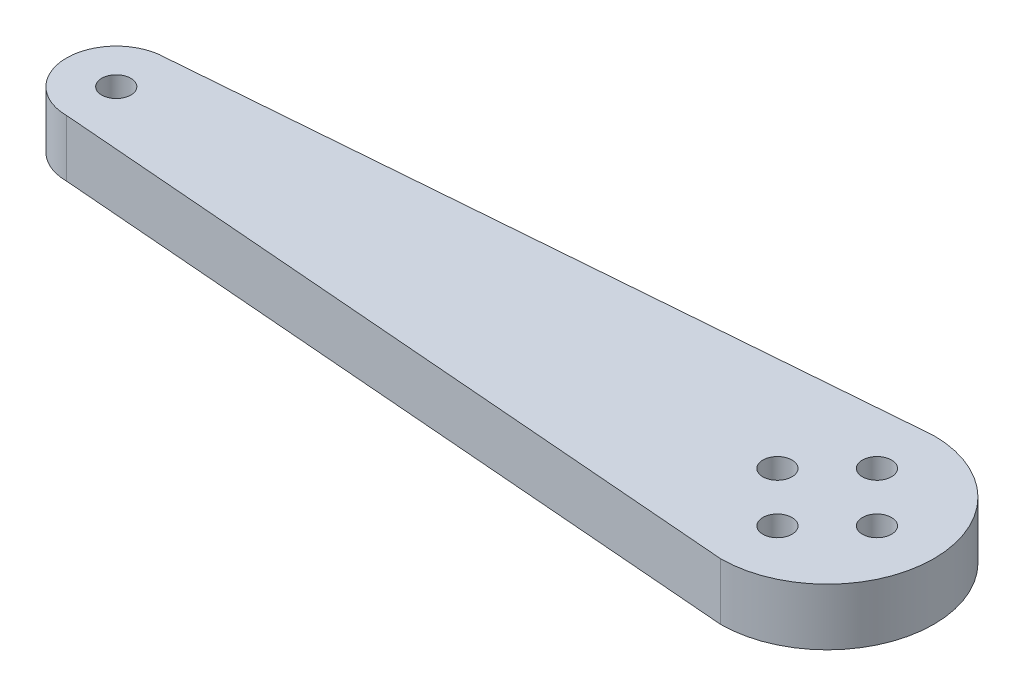
ISO-10303-21;
HEADER;
FILE_DESCRIPTION(('STEP AP214'),'2;1');
FILE_NAME('part.step','',(''),(''),'','','');
FILE_SCHEMA(('AUTOMOTIVE_DESIGN { 1 0 10303 214 1 1 1 1 }'));
ENDSEC;
DATA;
#1=APPLICATION_CONTEXT('core data for automotive mechanical design processes');
#2=APPLICATION_PROTOCOL_DEFINITION('international standard','automotive_design',2000,#1);
#3=PRODUCT_CONTEXT('',#1,'mechanical');
#4=PRODUCT('Part','Part','',(#3));
#5=PRODUCT_RELATED_PRODUCT_CATEGORY('part','',(#4));
#6=PRODUCT_DEFINITION_FORMATION('','',#4);
#7=PRODUCT_DEFINITION_CONTEXT('part definition',#1,'design');
#8=PRODUCT_DEFINITION('design','',#6,#7);
#9=PRODUCT_DEFINITION_SHAPE('','',#8);
#10=(LENGTH_UNIT() NAMED_UNIT(*) SI_UNIT(.MILLI.,.METRE.));
#11=(NAMED_UNIT(*) PLANE_ANGLE_UNIT() SI_UNIT($,.RADIAN.));
#12=(NAMED_UNIT(*) SI_UNIT($,.STERADIAN.) SOLID_ANGLE_UNIT());
#13=UNCERTAINTY_MEASURE_WITH_UNIT(LENGTH_MEASURE(1.E-05),#10,'distance_accuracy_value','');
#14=(GEOMETRIC_REPRESENTATION_CONTEXT(3) GLOBAL_UNCERTAINTY_ASSIGNED_CONTEXT((#13)) GLOBAL_UNIT_ASSIGNED_CONTEXT((#10,
#11,#12)) REPRESENTATION_CONTEXT('',''));
#15=CARTESIAN_POINT('',(0.,0.,0.));
#16=DIRECTION('',(0.,0.,1.));
#17=DIRECTION('',(1.,0.,0.));
#18=AXIS2_PLACEMENT_3D('',#15,#16,#17);
#19=CARTESIAN_POINT('',(100.,8.,0.));
#20=DIRECTION('',(0.,1.,0.));
#21=DIRECTION('',(0.,0.,1.));
#22=AXIS2_PLACEMENT_3D('',#19,#20,#21);
#23=PLANE('',#22);
#24=CARTESIAN_POINT('',(107.,8.,0.));
#25=DIRECTION('',(0.,1.,0.));
#26=DIRECTION('',(0.,0.,1.));
#27=AXIS2_PLACEMENT_3D('',#24,#25,#26);
#28=CIRCLE('',#27,2.04999999999999);
#29=CARTESIAN_POINT('',(107.,8.,2.04999999999999));
#30=VERTEX_POINT('',#29);
#31=EDGE_CURVE('E154',#30,#30,#28,.T.);
#32=ORIENTED_EDGE('',*,*,#31,.F.);
#33=EDGE_LOOP('',(#32));
#34=FACE_BOUND('',#33,.T.);
#35=CARTESIAN_POINT('',(100.,8.,7.));
#36=DIRECTION('',(0.,1.,0.));
#37=DIRECTION('',(0.,0.,1.));
#38=AXIS2_PLACEMENT_3D('',#35,#36,#37);
#39=CIRCLE('',#38,2.04999999999999);
#40=CARTESIAN_POINT('',(100.,8.,9.04999999999999));
#41=VERTEX_POINT('',#40);
#42=EDGE_CURVE('E138',#41,#41,#39,.T.);
#43=ORIENTED_EDGE('',*,*,#42,.F.);
#44=EDGE_LOOP('',(#43));
#45=FACE_BOUND('',#44,.T.);
#46=CARTESIAN_POINT('',(100.,8.,0.));
#47=DIRECTION('',(0.,1.,0.));
#48=DIRECTION('',(0.,0.,1.));
#49=AXIS2_PLACEMENT_3D('',#46,#47,#48);
#50=CIRCLE('',#49,15.);
#51=CARTESIAN_POINT('',(100.,8.,15.));
#52=VERTEX_POINT('',#51);
#53=CARTESIAN_POINT('',(100.,8.,-15.));
#54=VERTEX_POINT('',#53);
#55=EDGE_CURVE('E96',#52,#54,#50,.T.);
#56=ORIENTED_EDGE('',*,*,#55,.T.);
#57=DIRECTION('',(-0.996815278536125,0.,0.07974522228289));
#58=VECTOR('',#57,1.);
#59=CARTESIAN_POINT('',(100.,8.,-15.));
#60=LINE('',#59,#58);
#61=CARTESIAN_POINT('',(0.,8.,-7.));
#62=VERTEX_POINT('',#61);
#63=EDGE_CURVE('E91',#54,#62,#60,.T.);
#64=ORIENTED_EDGE('',*,*,#63,.T.);
#65=CARTESIAN_POINT('',(0.,8.,0.));
#66=DIRECTION('',(0.,1.,0.));
#67=DIRECTION('',(0.,0.,1.));
#68=AXIS2_PLACEMENT_3D('',#65,#66,#67);
#69=CIRCLE('',#68,7.);
#70=CARTESIAN_POINT('',(0.,8.,7.));
#71=VERTEX_POINT('',#70);
#72=EDGE_CURVE('E94',#62,#71,#69,.T.);
#73=ORIENTED_EDGE('',*,*,#72,.T.);
#74=DIRECTION('',(0.996815278536125,0.,0.07974522228289));
#75=VECTOR('',#74,1.);
#76=CARTESIAN_POINT('',(100.,8.,15.));
#77=LINE('',#76,#75);
#78=EDGE_CURVE('E61',#71,#52,#77,.T.);
#79=ORIENTED_EDGE('',*,*,#78,.T.);
#80=EDGE_LOOP('',(#56,#64,#73,#79));
#81=FACE_BOUND('',#80,.T.);
#82=CARTESIAN_POINT('',(100.,8.,-7.));
#83=DIRECTION('',(0.,1.,0.));
#84=DIRECTION('',(0.,0.,1.));
#85=AXIS2_PLACEMENT_3D('',#82,#83,#84);
#86=CIRCLE('',#85,2.04999999999999);
#87=CARTESIAN_POINT('',(100.,8.,-4.95000000000001));
#88=VERTEX_POINT('',#87);
#89=EDGE_CURVE('E116',#88,#88,#86,.T.);
#90=ORIENTED_EDGE('',*,*,#89,.F.);
#91=EDGE_LOOP('',(#90));
#92=FACE_BOUND('',#91,.T.);
#93=CARTESIAN_POINT('',(93.,8.,0.));
#94=DIRECTION('',(0.,1.,0.));
#95=DIRECTION('',(0.,0.,1.));
#96=AXIS2_PLACEMENT_3D('',#93,#94,#95);
#97=CIRCLE('',#96,2.04999999999999);
#98=CARTESIAN_POINT('',(93.,8.,2.04999999999999));
#99=VERTEX_POINT('',#98);
#100=EDGE_CURVE('E146',#99,#99,#97,.T.);
#101=ORIENTED_EDGE('',*,*,#100,.F.);
#102=EDGE_LOOP('',(#101));
#103=FACE_BOUND('',#102,.T.);
#104=CARTESIAN_POINT('',(0.,8.,0.));
#105=DIRECTION('',(0.,1.,0.));
#106=DIRECTION('',(0.,0.,1.));
#107=AXIS2_PLACEMENT_3D('',#104,#105,#106);
#108=CIRCLE('',#107,2.05);
#109=CARTESIAN_POINT('',(0.,8.,2.05));
#110=VERTEX_POINT('',#109);
#111=EDGE_CURVE('E162',#110,#110,#108,.T.);
#112=ORIENTED_EDGE('',*,*,#111,.F.);
#113=EDGE_LOOP('',(#112));
#114=FACE_BOUND('',#113,.T.);
#115=ADVANCED_FACE('F43',(#34,#45,#81,#92,#103,#114),#23,.T.);
#116=CARTESIAN_POINT('',(100.,0.,0.));
#117=DIRECTION('',(0.,1.,0.));
#118=DIRECTION('',(0.,0.,1.));
#119=AXIS2_PLACEMENT_3D('',#116,#117,#118);
#120=PLANE('',#119);
#121=CARTESIAN_POINT('',(100.,0.,0.));
#122=DIRECTION('',(0.,1.,0.));
#123=DIRECTION('',(0.,0.,1.));
#124=AXIS2_PLACEMENT_3D('',#121,#122,#123);
#125=CIRCLE('',#124,15.);
#126=CARTESIAN_POINT('',(100.,0.,15.));
#127=VERTEX_POINT('',#126);
#128=CARTESIAN_POINT('',(100.,0.,-15.));
#129=VERTEX_POINT('',#128);
#130=EDGE_CURVE('E112',#127,#129,#125,.T.);
#131=ORIENTED_EDGE('',*,*,#130,.F.);
#132=DIRECTION('',(0.996815278536125,0.,0.07974522228289));
#133=VECTOR('',#132,1.);
#134=CARTESIAN_POINT('',(100.,0.,15.));
#135=LINE('',#134,#133);
#136=CARTESIAN_POINT('',(0.,0.,7.));
#137=VERTEX_POINT('',#136);
#138=EDGE_CURVE('E84',#137,#127,#135,.T.);
#139=ORIENTED_EDGE('',*,*,#138,.F.);
#140=CARTESIAN_POINT('',(0.,0.,0.));
#141=DIRECTION('',(0.,1.,0.));
#142=DIRECTION('',(0.,0.,1.));
#143=AXIS2_PLACEMENT_3D('',#140,#141,#142);
#144=CIRCLE('',#143,7.);
#145=CARTESIAN_POINT('',(0.,0.,-7.));
#146=VERTEX_POINT('',#145);
#147=EDGE_CURVE('E78',#146,#137,#144,.T.);
#148=ORIENTED_EDGE('',*,*,#147,.F.);
#149=DIRECTION('',(-0.996815278536125,0.,0.07974522228289));
#150=VECTOR('',#149,1.);
#151=CARTESIAN_POINT('',(100.,0.,-15.));
#152=LINE('',#151,#150);
#153=EDGE_CURVE('E101',#129,#146,#152,.T.);
#154=ORIENTED_EDGE('',*,*,#153,.F.);
#155=EDGE_LOOP('',(#131,#139,#148,#154));
#156=FACE_BOUND('',#155,.T.);
#157=CARTESIAN_POINT('',(100.,0.,-7.));
#158=DIRECTION('',(0.,1.,0.));
#159=DIRECTION('',(0.,0.,1.));
#160=AXIS2_PLACEMENT_3D('',#157,#158,#159);
#161=CIRCLE('',#160,2.04999999999999);
#162=CARTESIAN_POINT('',(100.,0.,-4.95000000000001));
#163=VERTEX_POINT('',#162);
#164=EDGE_CURVE('E134',#163,#163,#161,.T.);
#165=ORIENTED_EDGE('',*,*,#164,.T.);
#166=EDGE_LOOP('',(#165));
#167=FACE_BOUND('',#166,.T.);
#168=CARTESIAN_POINT('',(100.,0.,7.));
#169=DIRECTION('',(0.,1.,0.));
#170=DIRECTION('',(0.,0.,1.));
#171=AXIS2_PLACEMENT_3D('',#168,#169,#170);
#172=CIRCLE('',#171,2.04999999999999);
#173=CARTESIAN_POINT('',(100.,0.,9.04999999999999));
#174=VERTEX_POINT('',#173);
#175=EDGE_CURVE('E142',#174,#174,#172,.T.);
#176=ORIENTED_EDGE('',*,*,#175,.T.);
#177=EDGE_LOOP('',(#176));
#178=FACE_BOUND('',#177,.T.);
#179=CARTESIAN_POINT('',(93.,0.,0.));
#180=DIRECTION('',(0.,1.,0.));
#181=DIRECTION('',(0.,0.,1.));
#182=AXIS2_PLACEMENT_3D('',#179,#180,#181);
#183=CIRCLE('',#182,2.04999999999999);
#184=CARTESIAN_POINT('',(93.,0.,2.04999999999999));
#185=VERTEX_POINT('',#184);
#186=EDGE_CURVE('E150',#185,#185,#183,.T.);
#187=ORIENTED_EDGE('',*,*,#186,.T.);
#188=EDGE_LOOP('',(#187));
#189=FACE_BOUND('',#188,.T.);
#190=CARTESIAN_POINT('',(107.,0.,0.));
#191=DIRECTION('',(0.,1.,0.));
#192=DIRECTION('',(0.,0.,1.));
#193=AXIS2_PLACEMENT_3D('',#190,#191,#192);
#194=CIRCLE('',#193,2.04999999999999);
#195=CARTESIAN_POINT('',(107.,0.,2.04999999999999));
#196=VERTEX_POINT('',#195);
#197=EDGE_CURVE('E158',#196,#196,#194,.T.);
#198=ORIENTED_EDGE('',*,*,#197,.T.);
#199=EDGE_LOOP('',(#198));
#200=FACE_BOUND('',#199,.T.);
#201=CARTESIAN_POINT('',(0.,0.,0.));
#202=DIRECTION('',(0.,1.,0.));
#203=DIRECTION('',(0.,0.,1.));
#204=AXIS2_PLACEMENT_3D('',#201,#202,#203);
#205=CIRCLE('',#204,2.05);
#206=CARTESIAN_POINT('',(0.,0.,2.05));
#207=VERTEX_POINT('',#206);
#208=EDGE_CURVE('E166',#207,#207,#205,.T.);
#209=ORIENTED_EDGE('',*,*,#208,.T.);
#210=EDGE_LOOP('',(#209));
#211=FACE_BOUND('',#210,.T.);
#212=ADVANCED_FACE('F129',(#156,#167,#178,#189,#200,#211),#120,.F.);
#213=CARTESIAN_POINT('',(100.,8.,0.));
#214=DIRECTION('',(0.,-1.,0.));
#215=DIRECTION('',(0.,0.,-1.));
#216=AXIS2_PLACEMENT_3D('',#213,#214,#215);
#217=CYLINDRICAL_SURFACE('',#216,15.);
#218=ORIENTED_EDGE('',*,*,#130,.T.);
#219=DIRECTION('',(0.,-1.,0.));
#220=VECTOR('',#219,1.);
#221=CARTESIAN_POINT('',(100.,8.,-15.));
#222=LINE('',#221,#220);
#223=EDGE_CURVE('E11',#54,#129,#222,.T.);
#224=ORIENTED_EDGE('',*,*,#223,.F.);
#225=ORIENTED_EDGE('',*,*,#55,.F.);
#226=DIRECTION('',(0.,-1.,0.));
#227=VECTOR('',#226,1.);
#228=CARTESIAN_POINT('',(100.,8.,15.));
#229=LINE('',#228,#227);
#230=EDGE_CURVE('E108',#52,#127,#229,.T.);
#231=ORIENTED_EDGE('',*,*,#230,.T.);
#232=EDGE_LOOP('',(#218,#224,#225,#231));
#233=FACE_BOUND('',#232,.T.);
#234=ADVANCED_FACE('F45',(#233),#217,.T.);
#235=CARTESIAN_POINT('',(100.,8.,-15.));
#236=DIRECTION('',(0.07974522228289,0.,0.996815278536125));
#237=DIRECTION('',(0.996815278536125,0.,-0.07974522228289));
#238=AXIS2_PLACEMENT_3D('',#235,#236,#237);
#239=PLANE('',#238);
#240=ORIENTED_EDGE('',*,*,#153,.T.);
#241=DIRECTION('',(0.,-1.,0.));
#242=VECTOR('',#241,1.);
#243=CARTESIAN_POINT('',(0.,8.,-7.));
#244=LINE('',#243,#242);
#245=EDGE_CURVE('E53',#62,#146,#244,.T.);
#246=ORIENTED_EDGE('',*,*,#245,.F.);
#247=ORIENTED_EDGE('',*,*,#63,.F.);
#248=ORIENTED_EDGE('',*,*,#223,.T.);
#249=EDGE_LOOP('',(#240,#246,#247,#248));
#250=FACE_BOUND('',#249,.T.);
#251=ADVANCED_FACE('F100',(#250),#239,.F.);
#252=CARTESIAN_POINT('',(0.,8.,0.));
#253=DIRECTION('',(0.,-1.,0.));
#254=DIRECTION('',(0.,0.,-1.));
#255=AXIS2_PLACEMENT_3D('',#252,#253,#254);
#256=CYLINDRICAL_SURFACE('',#255,7.);
#257=ORIENTED_EDGE('',*,*,#147,.T.);
#258=DIRECTION('',(0.,-1.,0.));
#259=VECTOR('',#258,1.);
#260=CARTESIAN_POINT('',(0.,8.,7.));
#261=LINE('',#260,#259);
#262=EDGE_CURVE('E103',#71,#137,#261,.T.);
#263=ORIENTED_EDGE('',*,*,#262,.F.);
#264=ORIENTED_EDGE('',*,*,#72,.F.);
#265=ORIENTED_EDGE('',*,*,#245,.T.);
#266=EDGE_LOOP('',(#257,#263,#264,#265));
#267=FACE_BOUND('',#266,.T.);
#268=ADVANCED_FACE('F104',(#267),#256,.T.);
#269=CARTESIAN_POINT('',(100.,8.,15.));
#270=DIRECTION('',(0.07974522228289,0.,-0.996815278536125));
#271=DIRECTION('',(-0.996815278536125,0.,-0.07974522228289));
#272=AXIS2_PLACEMENT_3D('',#269,#270,#271);
#273=PLANE('',#272);
#274=ORIENTED_EDGE('',*,*,#138,.T.);
#275=ORIENTED_EDGE('',*,*,#230,.F.);
#276=ORIENTED_EDGE('',*,*,#78,.F.);
#277=ORIENTED_EDGE('',*,*,#262,.T.);
#278=EDGE_LOOP('',(#274,#275,#276,#277));
#279=FACE_BOUND('',#278,.T.);
#280=ADVANCED_FACE('F126',(#279),#273,.F.);
#281=CARTESIAN_POINT('',(100.,8.,-7.));
#282=DIRECTION('',(0.,-1.,0.));
#283=DIRECTION('',(0.,0.,-1.));
#284=AXIS2_PLACEMENT_3D('',#281,#282,#283);
#285=CYLINDRICAL_SURFACE('',#284,2.04999999999999);
#286=ORIENTED_EDGE('',*,*,#89,.T.);
#287=EDGE_LOOP('',(#286));
#288=FACE_BOUND('',#287,.T.);
#289=ORIENTED_EDGE('',*,*,#164,.F.);
#290=EDGE_LOOP('',(#289));
#291=FACE_BOUND('',#290,.T.);
#292=ADVANCED_FACE('F187',(#288,#291),#285,.F.);
#293=CARTESIAN_POINT('',(100.,8.,7.));
#294=DIRECTION('',(0.,-1.,0.));
#295=DIRECTION('',(0.,0.,-1.));
#296=AXIS2_PLACEMENT_3D('',#293,#294,#295);
#297=CYLINDRICAL_SURFACE('',#296,2.04999999999999);
#298=ORIENTED_EDGE('',*,*,#42,.T.);
#299=EDGE_LOOP('',(#298));
#300=FACE_BOUND('',#299,.T.);
#301=ORIENTED_EDGE('',*,*,#175,.F.);
#302=EDGE_LOOP('',(#301));
#303=FACE_BOUND('',#302,.T.);
#304=ADVANCED_FACE('F241',(#300,#303),#297,.F.);
#305=CARTESIAN_POINT('',(93.,8.,0.));
#306=DIRECTION('',(0.,-1.,0.));
#307=DIRECTION('',(0.,0.,-1.));
#308=AXIS2_PLACEMENT_3D('',#305,#306,#307);
#309=CYLINDRICAL_SURFACE('',#308,2.04999999999999);
#310=ORIENTED_EDGE('',*,*,#100,.T.);
#311=EDGE_LOOP('',(#310));
#312=FACE_BOUND('',#311,.T.);
#313=ORIENTED_EDGE('',*,*,#186,.F.);
#314=EDGE_LOOP('',(#313));
#315=FACE_BOUND('',#314,.T.);
#316=ADVANCED_FACE('F250',(#312,#315),#309,.F.);
#317=CARTESIAN_POINT('',(107.,8.,0.));
#318=DIRECTION('',(0.,-1.,0.));
#319=DIRECTION('',(0.,0.,-1.));
#320=AXIS2_PLACEMENT_3D('',#317,#318,#319);
#321=CYLINDRICAL_SURFACE('',#320,2.04999999999999);
#322=ORIENTED_EDGE('',*,*,#31,.T.);
#323=EDGE_LOOP('',(#322));
#324=FACE_BOUND('',#323,.T.);
#325=ORIENTED_EDGE('',*,*,#197,.F.);
#326=EDGE_LOOP('',(#325));
#327=FACE_BOUND('',#326,.T.);
#328=ADVANCED_FACE('F259',(#324,#327),#321,.F.);
#329=CARTESIAN_POINT('',(0.,8.,0.));
#330=DIRECTION('',(0.,-1.,0.));
#331=DIRECTION('',(0.,0.,-1.));
#332=AXIS2_PLACEMENT_3D('',#329,#330,#331);
#333=CYLINDRICAL_SURFACE('',#332,2.05);
#334=ORIENTED_EDGE('',*,*,#111,.T.);
#335=EDGE_LOOP('',(#334));
#336=FACE_BOUND('',#335,.T.);
#337=ORIENTED_EDGE('',*,*,#208,.F.);
#338=EDGE_LOOP('',(#337));
#339=FACE_BOUND('',#338,.T.);
#340=ADVANCED_FACE('F174',(#336,#339),#333,.F.);
#341=CLOSED_SHELL('',(#115,#212,#234,#251,#268,#280,#292,#304,#316,#328,#340));
#342=MANIFOLD_SOLID_BREP('B2',#341);
#343=ADVANCED_BREP_SHAPE_REPRESENTATION('',(#18,#342),#14);
#344=SHAPE_DEFINITION_REPRESENTATION(#9,#343);
ENDSEC;
END-ISO-10303-21;
